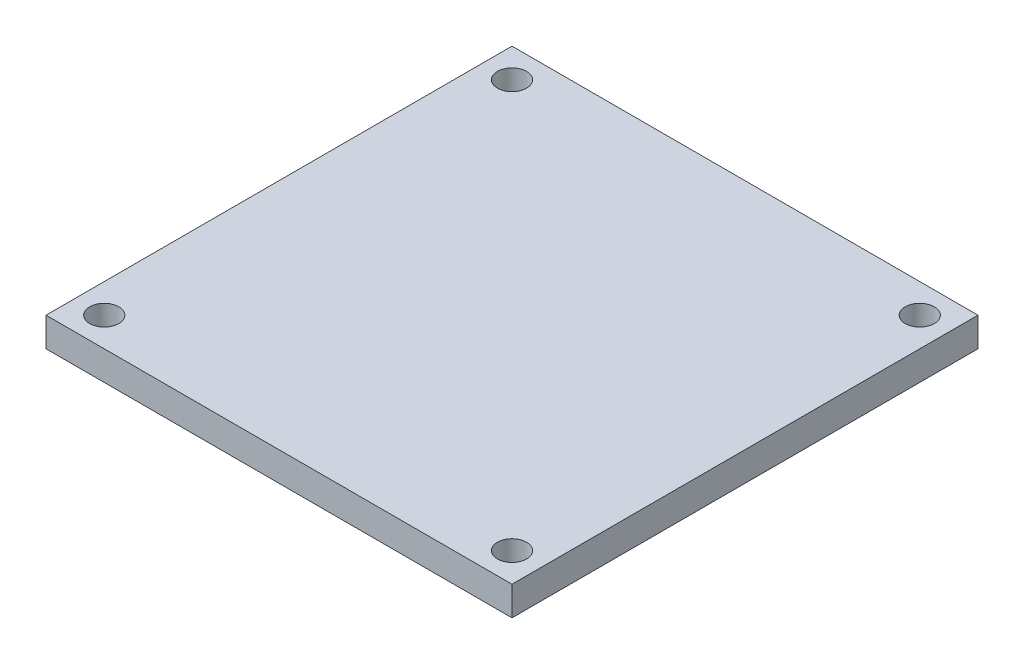
ISO-10303-21;
HEADER;
FILE_DESCRIPTION(('STEP AP214'),'2;1');
FILE_NAME('part.step','',(''),(''),'','','');
FILE_SCHEMA(('AUTOMOTIVE_DESIGN { 1 0 10303 214 1 1 1 1 }'));
ENDSEC;
DATA;
#1=APPLICATION_CONTEXT('core data for automotive mechanical design processes');
#2=APPLICATION_PROTOCOL_DEFINITION('international standard','automotive_design',2000,#1);
#3=PRODUCT_CONTEXT('',#1,'mechanical');
#4=PRODUCT('Part','Part','',(#3));
#5=PRODUCT_RELATED_PRODUCT_CATEGORY('part','',(#4));
#6=PRODUCT_DEFINITION_FORMATION('','',#4);
#7=PRODUCT_DEFINITION_CONTEXT('part definition',#1,'design');
#8=PRODUCT_DEFINITION('design','',#6,#7);
#9=PRODUCT_DEFINITION_SHAPE('','',#8);
#10=(LENGTH_UNIT() NAMED_UNIT(*) SI_UNIT(.MILLI.,.METRE.));
#11=(NAMED_UNIT(*) PLANE_ANGLE_UNIT() SI_UNIT($,.RADIAN.));
#12=(NAMED_UNIT(*) SI_UNIT($,.STERADIAN.) SOLID_ANGLE_UNIT());
#13=UNCERTAINTY_MEASURE_WITH_UNIT(LENGTH_MEASURE(1.E-05),#10,'distance_accuracy_value','');
#14=(GEOMETRIC_REPRESENTATION_CONTEXT(3) GLOBAL_UNCERTAINTY_ASSIGNED_CONTEXT((#13)) GLOBAL_UNIT_ASSIGNED_CONTEXT((#10,
#11,#12)) REPRESENTATION_CONTEXT('',''));
#15=CARTESIAN_POINT('',(0.,0.,0.));
#16=DIRECTION('',(0.,0.,1.));
#17=DIRECTION('',(1.,0.,0.));
#18=AXIS2_PLACEMENT_3D('',#15,#16,#17);
#19=CARTESIAN_POINT('',(25.4,3.175,-25.4));
#20=DIRECTION('',(-1.,0.,0.));
#21=DIRECTION('',(0.,0.,1.));
#22=AXIS2_PLACEMENT_3D('',#19,#20,#21);
#23=PLANE('',#22);
#24=DIRECTION('',(0.,0.,-1.));
#25=VECTOR('',#24,1.);
#26=CARTESIAN_POINT('',(25.4,0.,-25.4));
#27=LINE('',#26,#25);
#28=CARTESIAN_POINT('',(25.4,0.,25.4));
#29=VERTEX_POINT('',#28);
#30=CARTESIAN_POINT('',(25.4,0.,-25.4));
#31=VERTEX_POINT('',#30);
#32=EDGE_CURVE('E98',#29,#31,#27,.T.);
#33=ORIENTED_EDGE('',*,*,#32,.T.);
#34=DIRECTION('',(0.,-1.,0.));
#35=VECTOR('',#34,1.);
#36=CARTESIAN_POINT('',(25.4,3.175,-25.4));
#37=LINE('',#36,#35);
#38=CARTESIAN_POINT('',(25.4,3.175,-25.4));
#39=VERTEX_POINT('',#38);
#40=EDGE_CURVE('E11',#39,#31,#37,.T.);
#41=ORIENTED_EDGE('',*,*,#40,.F.);
#42=DIRECTION('',(0.,0.,-1.));
#43=VECTOR('',#42,1.);
#44=CARTESIAN_POINT('',(25.4,3.175,-25.4));
#45=LINE('',#44,#43);
#46=CARTESIAN_POINT('',(25.4,3.175,25.4));
#47=VERTEX_POINT('',#46);
#48=EDGE_CURVE('E86',#47,#39,#45,.T.);
#49=ORIENTED_EDGE('',*,*,#48,.F.);
#50=DIRECTION('',(0.,-1.,0.));
#51=VECTOR('',#50,1.);
#52=CARTESIAN_POINT('',(25.4,3.175,25.4));
#53=LINE('',#52,#51);
#54=EDGE_CURVE('E94',#47,#29,#53,.T.);
#55=ORIENTED_EDGE('',*,*,#54,.T.);
#56=EDGE_LOOP('',(#33,#41,#49,#55));
#57=FACE_BOUND('',#56,.T.);
#58=ADVANCED_FACE('F35',(#57),#23,.F.);
#59=CARTESIAN_POINT('',(-25.4,3.175,-25.4));
#60=DIRECTION('',(0.,0.,1.));
#61=DIRECTION('',(1.,0.,0.));
#62=AXIS2_PLACEMENT_3D('',#59,#60,#61);
#63=PLANE('',#62);
#64=DIRECTION('',(-1.,0.,0.));
#65=VECTOR('',#64,1.);
#66=CARTESIAN_POINT('',(-25.4,0.,-25.4));
#67=LINE('',#66,#65);
#68=CARTESIAN_POINT('',(-25.4,0.,-25.4));
#69=VERTEX_POINT('',#68);
#70=EDGE_CURVE('E90',#31,#69,#67,.T.);
#71=ORIENTED_EDGE('',*,*,#70,.T.);
#72=DIRECTION('',(0.,-1.,0.));
#73=VECTOR('',#72,1.);
#74=CARTESIAN_POINT('',(-25.4,3.175,-25.4));
#75=LINE('',#74,#73);
#76=CARTESIAN_POINT('',(-25.4,3.175,-25.4));
#77=VERTEX_POINT('',#76);
#78=EDGE_CURVE('E43',#77,#69,#75,.T.);
#79=ORIENTED_EDGE('',*,*,#78,.F.);
#80=DIRECTION('',(-1.,0.,0.));
#81=VECTOR('',#80,1.);
#82=CARTESIAN_POINT('',(-25.4,3.175,-25.4));
#83=LINE('',#82,#81);
#84=EDGE_CURVE('E81',#39,#77,#83,.T.);
#85=ORIENTED_EDGE('',*,*,#84,.F.);
#86=ORIENTED_EDGE('',*,*,#40,.T.);
#87=EDGE_LOOP('',(#71,#79,#85,#86));
#88=FACE_BOUND('',#87,.T.);
#89=ADVANCED_FACE('F89',(#88),#63,.F.);
#90=CARTESIAN_POINT('',(-25.4,3.175,-25.4));
#91=DIRECTION('',(1.,0.,0.));
#92=DIRECTION('',(0.,0.,-1.));
#93=AXIS2_PLACEMENT_3D('',#90,#91,#92);
#94=PLANE('',#93);
#95=DIRECTION('',(0.,0.,1.));
#96=VECTOR('',#95,1.);
#97=CARTESIAN_POINT('',(-25.4,0.,-25.4));
#98=LINE('',#97,#96);
#99=CARTESIAN_POINT('',(-25.4,0.,25.4));
#100=VERTEX_POINT('',#99);
#101=EDGE_CURVE('E68',#69,#100,#98,.T.);
#102=ORIENTED_EDGE('',*,*,#101,.T.);
#103=DIRECTION('',(0.,-1.,0.));
#104=VECTOR('',#103,1.);
#105=CARTESIAN_POINT('',(-25.4,3.175,25.4));
#106=LINE('',#105,#104);
#107=CARTESIAN_POINT('',(-25.4,3.175,25.4));
#108=VERTEX_POINT('',#107);
#109=EDGE_CURVE('E91',#108,#100,#106,.T.);
#110=ORIENTED_EDGE('',*,*,#109,.F.);
#111=DIRECTION('',(0.,0.,1.));
#112=VECTOR('',#111,1.);
#113=CARTESIAN_POINT('',(-25.4,3.175,-25.4));
#114=LINE('',#113,#112);
#115=EDGE_CURVE('E84',#77,#108,#114,.T.);
#116=ORIENTED_EDGE('',*,*,#115,.F.);
#117=ORIENTED_EDGE('',*,*,#78,.T.);
#118=EDGE_LOOP('',(#102,#110,#116,#117));
#119=FACE_BOUND('',#118,.T.);
#120=ADVANCED_FACE('F92',(#119),#94,.F.);
#121=CARTESIAN_POINT('',(-25.4,3.175,25.4));
#122=DIRECTION('',(0.,0.,-1.));
#123=DIRECTION('',(-1.,0.,0.));
#124=AXIS2_PLACEMENT_3D('',#121,#122,#123);
#125=PLANE('',#124);
#126=DIRECTION('',(1.,0.,0.));
#127=VECTOR('',#126,1.);
#128=CARTESIAN_POINT('',(-25.4,0.,25.4));
#129=LINE('',#128,#127);
#130=EDGE_CURVE('E74',#100,#29,#129,.T.);
#131=ORIENTED_EDGE('',*,*,#130,.T.);
#132=ORIENTED_EDGE('',*,*,#54,.F.);
#133=DIRECTION('',(1.,0.,0.));
#134=VECTOR('',#133,1.);
#135=CARTESIAN_POINT('',(-25.4,3.175,25.4));
#136=LINE('',#135,#134);
#137=EDGE_CURVE('E51',#108,#47,#136,.T.);
#138=ORIENTED_EDGE('',*,*,#137,.F.);
#139=ORIENTED_EDGE('',*,*,#109,.T.);
#140=EDGE_LOOP('',(#131,#132,#138,#139));
#141=FACE_BOUND('',#140,.T.);
#142=ADVANCED_FACE('F106',(#141),#125,.F.);
#143=CARTESIAN_POINT('',(0.,3.175,0.));
#144=DIRECTION('',(0.,1.,0.));
#145=DIRECTION('',(0.,0.,1.));
#146=AXIS2_PLACEMENT_3D('',#143,#144,#145);
#147=PLANE('',#146);
#148=CARTESIAN_POINT('',(-22.225,3.175,-22.225));
#149=DIRECTION('',(0.,1.,0.));
#150=DIRECTION('',(0.,0.,-1.));
#151=AXIS2_PLACEMENT_3D('',#148,#149,#150);
#152=CIRCLE('',#151,1.5875);
#153=CARTESIAN_POINT('',(-22.225,3.175,-23.8125));
#154=VERTEX_POINT('',#153);
#155=EDGE_CURVE('E130',#154,#154,#152,.T.);
#156=ORIENTED_EDGE('',*,*,#155,.F.);
#157=EDGE_LOOP('',(#156));
#158=FACE_BOUND('',#157,.T.);
#159=CARTESIAN_POINT('',(22.225,3.175,-22.225));
#160=DIRECTION('',(0.,1.,0.));
#161=DIRECTION('',(0.,0.,1.));
#162=AXIS2_PLACEMENT_3D('',#159,#160,#161);
#163=CIRCLE('',#162,1.5875);
#164=CARTESIAN_POINT('',(22.225,3.175,-20.6375));
#165=VERTEX_POINT('',#164);
#166=EDGE_CURVE('E124',#165,#165,#163,.T.);
#167=ORIENTED_EDGE('',*,*,#166,.F.);
#168=EDGE_LOOP('',(#167));
#169=FACE_BOUND('',#168,.T.);
#170=CARTESIAN_POINT('',(22.225,3.175,22.225));
#171=DIRECTION('',(0.,1.,0.));
#172=DIRECTION('',(0.,0.,-1.));
#173=AXIS2_PLACEMENT_3D('',#170,#171,#172);
#174=CIRCLE('',#173,1.5875);
#175=CARTESIAN_POINT('',(22.225,3.175,20.6375));
#176=VERTEX_POINT('',#175);
#177=EDGE_CURVE('E118',#176,#176,#174,.T.);
#178=ORIENTED_EDGE('',*,*,#177,.F.);
#179=EDGE_LOOP('',(#178));
#180=FACE_BOUND('',#179,.T.);
#181=CARTESIAN_POINT('',(-22.225,3.175,22.225));
#182=DIRECTION('',(0.,1.,0.));
#183=DIRECTION('',(0.,0.,1.));
#184=AXIS2_PLACEMENT_3D('',#181,#182,#183);
#185=CIRCLE('',#184,1.5875);
#186=CARTESIAN_POINT('',(-22.225,3.175,23.8125));
#187=VERTEX_POINT('',#186);
#188=EDGE_CURVE('E112',#187,#187,#185,.T.);
#189=ORIENTED_EDGE('',*,*,#188,.F.);
#190=EDGE_LOOP('',(#189));
#191=FACE_BOUND('',#190,.T.);
#192=ORIENTED_EDGE('',*,*,#48,.T.);
#193=ORIENTED_EDGE('',*,*,#84,.T.);
#194=ORIENTED_EDGE('',*,*,#115,.T.);
#195=ORIENTED_EDGE('',*,*,#137,.T.);
#196=EDGE_LOOP('',(#192,#193,#194,#195));
#197=FACE_BOUND('',#196,.T.);
#198=ADVANCED_FACE('F82',(#158,#169,#180,#191,#197),#147,.T.);
#199=CARTESIAN_POINT('',(0.,0.,0.));
#200=DIRECTION('',(0.,1.,0.));
#201=DIRECTION('',(0.,0.,1.));
#202=AXIS2_PLACEMENT_3D('',#199,#200,#201);
#203=PLANE('',#202);
#204=CARTESIAN_POINT('',(-22.225,0.,-22.225));
#205=DIRECTION('',(0.,1.,0.));
#206=DIRECTION('',(0.,0.,-1.));
#207=AXIS2_PLACEMENT_3D('',#204,#205,#206);
#208=CIRCLE('',#207,1.5875);
#209=CARTESIAN_POINT('',(-22.225,0.,-23.8125));
#210=VERTEX_POINT('',#209);
#211=EDGE_CURVE('E127',#210,#210,#208,.T.);
#212=ORIENTED_EDGE('',*,*,#211,.T.);
#213=EDGE_LOOP('',(#212));
#214=FACE_BOUND('',#213,.T.);
#215=CARTESIAN_POINT('',(22.225,0.,-22.225));
#216=DIRECTION('',(0.,1.,0.));
#217=DIRECTION('',(0.,0.,1.));
#218=AXIS2_PLACEMENT_3D('',#215,#216,#217);
#219=CIRCLE('',#218,1.5875);
#220=CARTESIAN_POINT('',(22.225,0.,-20.6375));
#221=VERTEX_POINT('',#220);
#222=EDGE_CURVE('E121',#221,#221,#219,.T.);
#223=ORIENTED_EDGE('',*,*,#222,.T.);
#224=EDGE_LOOP('',(#223));
#225=FACE_BOUND('',#224,.T.);
#226=CARTESIAN_POINT('',(22.225,0.,22.225));
#227=DIRECTION('',(0.,1.,0.));
#228=DIRECTION('',(0.,0.,-1.));
#229=AXIS2_PLACEMENT_3D('',#226,#227,#228);
#230=CIRCLE('',#229,1.5875);
#231=CARTESIAN_POINT('',(22.225,0.,20.6375));
#232=VERTEX_POINT('',#231);
#233=EDGE_CURVE('E115',#232,#232,#230,.T.);
#234=ORIENTED_EDGE('',*,*,#233,.T.);
#235=EDGE_LOOP('',(#234));
#236=FACE_BOUND('',#235,.T.);
#237=CARTESIAN_POINT('',(-22.225,0.,22.225));
#238=DIRECTION('',(0.,1.,0.));
#239=DIRECTION('',(0.,0.,1.));
#240=AXIS2_PLACEMENT_3D('',#237,#238,#239);
#241=CIRCLE('',#240,1.5875);
#242=CARTESIAN_POINT('',(-22.225,0.,23.8125));
#243=VERTEX_POINT('',#242);
#244=EDGE_CURVE('E101',#243,#243,#241,.T.);
#245=ORIENTED_EDGE('',*,*,#244,.T.);
#246=EDGE_LOOP('',(#245));
#247=FACE_BOUND('',#246,.T.);
#248=ORIENTED_EDGE('',*,*,#32,.F.);
#249=ORIENTED_EDGE('',*,*,#130,.F.);
#250=ORIENTED_EDGE('',*,*,#101,.F.);
#251=ORIENTED_EDGE('',*,*,#70,.F.);
#252=EDGE_LOOP('',(#248,#249,#250,#251));
#253=FACE_BOUND('',#252,.T.);
#254=ADVANCED_FACE('F109',(#214,#225,#236,#247,#253),#203,.F.);
#255=CARTESIAN_POINT('',(-22.225,0.,22.225));
#256=DIRECTION('',(0.,1.,0.));
#257=DIRECTION('',(0.,0.,1.));
#258=AXIS2_PLACEMENT_3D('',#255,#256,#257);
#259=CYLINDRICAL_SURFACE('',#258,1.5875);
#260=ORIENTED_EDGE('',*,*,#244,.F.);
#261=EDGE_LOOP('',(#260));
#262=FACE_BOUND('',#261,.T.);
#263=ORIENTED_EDGE('',*,*,#188,.T.);
#264=EDGE_LOOP('',(#263));
#265=FACE_BOUND('',#264,.T.);
#266=ADVANCED_FACE('F154',(#262,#265),#259,.F.);
#267=CARTESIAN_POINT('',(22.225,0.,22.225));
#268=DIRECTION('',(0.,1.,0.));
#269=DIRECTION('',(0.,0.,1.));
#270=AXIS2_PLACEMENT_3D('',#267,#268,#269);
#271=CYLINDRICAL_SURFACE('',#270,1.5875);
#272=ORIENTED_EDGE('',*,*,#233,.F.);
#273=EDGE_LOOP('',(#272));
#274=FACE_BOUND('',#273,.T.);
#275=ORIENTED_EDGE('',*,*,#177,.T.);
#276=EDGE_LOOP('',(#275));
#277=FACE_BOUND('',#276,.T.);
#278=ADVANCED_FACE('F156',(#274,#277),#271,.F.);
#279=CARTESIAN_POINT('',(22.225,0.,-22.225));
#280=DIRECTION('',(0.,1.,0.));
#281=DIRECTION('',(0.,0.,1.));
#282=AXIS2_PLACEMENT_3D('',#279,#280,#281);
#283=CYLINDRICAL_SURFACE('',#282,1.5875);
#284=ORIENTED_EDGE('',*,*,#222,.F.);
#285=EDGE_LOOP('',(#284));
#286=FACE_BOUND('',#285,.T.);
#287=ORIENTED_EDGE('',*,*,#166,.T.);
#288=EDGE_LOOP('',(#287));
#289=FACE_BOUND('',#288,.T.);
#290=ADVANCED_FACE('F141',(#286,#289),#283,.F.);
#291=CARTESIAN_POINT('',(-22.225,0.,-22.225));
#292=DIRECTION('',(0.,1.,0.));
#293=DIRECTION('',(0.,0.,1.));
#294=AXIS2_PLACEMENT_3D('',#291,#292,#293);
#295=CYLINDRICAL_SURFACE('',#294,1.5875);
#296=ORIENTED_EDGE('',*,*,#211,.F.);
#297=EDGE_LOOP('',(#296));
#298=FACE_BOUND('',#297,.T.);
#299=ORIENTED_EDGE('',*,*,#155,.T.);
#300=EDGE_LOOP('',(#299));
#301=FACE_BOUND('',#300,.T.);
#302=ADVANCED_FACE('F138',(#298,#301),#295,.F.);
#303=CLOSED_SHELL('',(#58,#89,#120,#142,#198,#254,#266,#278,#290,#302));
#304=MANIFOLD_SOLID_BREP('B2',#303);
#305=ADVANCED_BREP_SHAPE_REPRESENTATION('',(#18,#304),#14);
#306=SHAPE_DEFINITION_REPRESENTATION(#9,#305);
ENDSEC;
END-ISO-10303-21;
